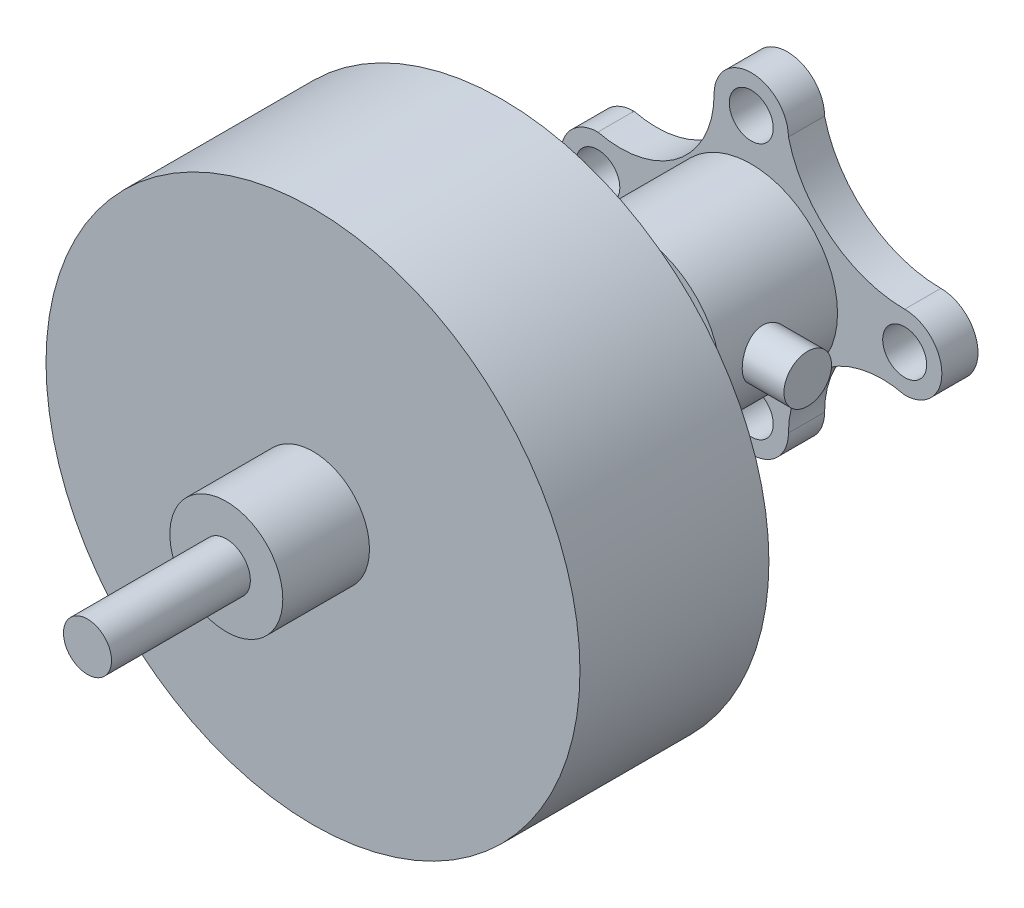
ISO-10303-21;
HEADER;
FILE_DESCRIPTION(('STEP AP214'),'2;1');
FILE_NAME('part.step','',(''),(''),'','','');
FILE_SCHEMA(('AUTOMOTIVE_DESIGN { 1 0 10303 214 1 1 1 1 }'));
ENDSEC;
DATA;
#1=APPLICATION_CONTEXT('core data for automotive mechanical design processes');
#2=APPLICATION_PROTOCOL_DEFINITION('international standard','automotive_design',2000,#1);
#3=PRODUCT_CONTEXT('',#1,'mechanical');
#4=PRODUCT('Part','Part','',(#3));
#5=PRODUCT_RELATED_PRODUCT_CATEGORY('part','',(#4));
#6=PRODUCT_DEFINITION_FORMATION('','',#4);
#7=PRODUCT_DEFINITION_CONTEXT('part definition',#1,'design');
#8=PRODUCT_DEFINITION('design','',#6,#7);
#9=PRODUCT_DEFINITION_SHAPE('','',#8);
#10=(LENGTH_UNIT() NAMED_UNIT(*) SI_UNIT(.MILLI.,.METRE.));
#11=(NAMED_UNIT(*) PLANE_ANGLE_UNIT() SI_UNIT($,.RADIAN.));
#12=(NAMED_UNIT(*) SI_UNIT($,.STERADIAN.) SOLID_ANGLE_UNIT());
#13=UNCERTAINTY_MEASURE_WITH_UNIT(LENGTH_MEASURE(1.E-05),#10,'distance_accuracy_value','');
#14=(GEOMETRIC_REPRESENTATION_CONTEXT(3) GLOBAL_UNCERTAINTY_ASSIGNED_CONTEXT((#13)) GLOBAL_UNIT_ASSIGNED_CONTEXT((#10,
#11,#12)) REPRESENTATION_CONTEXT('',''));
#15=CARTESIAN_POINT('',(0.,0.,0.));
#16=DIRECTION('',(0.,0.,1.));
#17=DIRECTION('',(1.,0.,0.));
#18=AXIS2_PLACEMENT_3D('',#15,#16,#17);
#19=CARTESIAN_POINT('',(0.,0.,34.6964));
#20=DIRECTION('',(0.,0.,1.));
#21=DIRECTION('',(1.,0.,0.));
#22=AXIS2_PLACEMENT_3D('',#19,#20,#21);
#23=PLANE('',#22);
#24=CARTESIAN_POINT('',(0.,0.,34.6964));
#25=DIRECTION('',(0.,0.,1.));
#26=DIRECTION('',(1.,0.,0.));
#27=AXIS2_PLACEMENT_3D('',#24,#25,#26);
#28=CIRCLE('',#27,3.4925);
#29=CARTESIAN_POINT('',(3.4925,0.,34.6964));
#30=VERTEX_POINT('',#29);
#31=EDGE_CURVE('E477',#30,#30,#28,.T.);
#32=ORIENTED_EDGE('',*,*,#31,.T.);
#33=EDGE_LOOP('',(#32));
#34=FACE_BOUND('',#33,.T.);
#35=CARTESIAN_POINT('',(0.,0.,34.6964));
#36=DIRECTION('',(0.,0.,1.));
#37=DIRECTION('',(1.,0.,0.));
#38=AXIS2_PLACEMENT_3D('',#35,#36,#37);
#39=CIRCLE('',#38,1.4859);
#40=CARTESIAN_POINT('',(1.4859,0.,34.6964));
#41=VERTEX_POINT('',#40);
#42=EDGE_CURVE('E474',#41,#41,#39,.T.);
#43=ORIENTED_EDGE('',*,*,#42,.F.);
#44=EDGE_LOOP('',(#43));
#45=FACE_BOUND('',#44,.T.);
#46=ADVANCED_FACE('F35',(#34,#45),#23,.T.);
#47=CARTESIAN_POINT('',(0.,0.,29.337));
#48=DIRECTION('',(0.,0.,1.));
#49=DIRECTION('',(1.,0.,0.));
#50=AXIS2_PLACEMENT_3D('',#47,#48,#49);
#51=PLANE('',#50);
#52=CARTESIAN_POINT('',(0.,0.,29.337));
#53=DIRECTION('',(0.,0.,1.));
#54=DIRECTION('',(1.,0.,0.));
#55=AXIS2_PLACEMENT_3D('',#52,#53,#54);
#56=CIRCLE('',#55,16.51);
#57=CARTESIAN_POINT('',(16.51,0.,29.337));
#58=VERTEX_POINT('',#57);
#59=EDGE_CURVE('E484',#58,#58,#56,.T.);
#60=ORIENTED_EDGE('',*,*,#59,.T.);
#61=EDGE_LOOP('',(#60));
#62=FACE_BOUND('',#61,.T.);
#63=CARTESIAN_POINT('',(0.,0.,29.337));
#64=DIRECTION('',(0.,0.,1.));
#65=DIRECTION('',(1.,0.,0.));
#66=AXIS2_PLACEMENT_3D('',#63,#64,#65);
#67=CIRCLE('',#66,3.4925);
#68=CARTESIAN_POINT('',(3.4925,0.,29.337));
#69=VERTEX_POINT('',#68);
#70=EDGE_CURVE('E473',#69,#69,#67,.T.);
#71=ORIENTED_EDGE('',*,*,#70,.F.);
#72=EDGE_LOOP('',(#71));
#73=FACE_BOUND('',#72,.T.);
#74=ADVANCED_FACE('F198',(#62,#73),#51,.T.);
#75=CARTESIAN_POINT('',(0.,0.,9.4488));
#76=DIRECTION('',(0.,0.,1.));
#77=DIRECTION('',(1.,0.,0.));
#78=AXIS2_PLACEMENT_3D('',#75,#76,#77);
#79=PLANE('',#78);
#80=CARTESIAN_POINT('',(0.,0.,9.4488));
#81=DIRECTION('',(0.,0.,1.));
#82=DIRECTION('',(1.,0.,0.));
#83=AXIS2_PLACEMENT_3D('',#80,#81,#82);
#84=CIRCLE('',#83,5.334);
#85=CARTESIAN_POINT('',(5.334,0.,9.4488));
#86=VERTEX_POINT('',#85);
#87=EDGE_CURVE('E144',#86,#86,#84,.T.);
#88=ORIENTED_EDGE('',*,*,#87,.T.);
#89=EDGE_LOOP('',(#88));
#90=FACE_BOUND('',#89,.T.);
#91=CARTESIAN_POINT('',(0.,0.,9.4488));
#92=DIRECTION('',(0.,0.,1.));
#93=DIRECTION('',(1.,0.,0.));
#94=AXIS2_PLACEMENT_3D('',#91,#92,#93);
#95=CIRCLE('',#94,3.96875);
#96=CARTESIAN_POINT('',(3.96875,0.,9.4488));
#97=VERTEX_POINT('',#96);
#98=EDGE_CURVE('E253',#97,#97,#95,.T.);
#99=ORIENTED_EDGE('',*,*,#98,.F.);
#100=EDGE_LOOP('',(#99));
#101=FACE_BOUND('',#100,.T.);
#102=ADVANCED_FACE('F195',(#90,#101),#79,.T.);
#103=CARTESIAN_POINT('',(0.,0.,2.2352));
#104=DIRECTION('',(0.,0.,1.));
#105=DIRECTION('',(1.,0.,0.));
#106=AXIS2_PLACEMENT_3D('',#103,#104,#105);
#107=PLANE('',#106);
#108=CARTESIAN_POINT('',(0.,-7.9248,2.2352));
#109=DIRECTION('',(0.,0.,1.));
#110=DIRECTION('',(1.,0.,0.));
#111=AXIS2_PLACEMENT_3D('',#108,#109,#110);
#112=CIRCLE('',#111,2.2987);
#113=CARTESIAN_POINT('',(-2.2987,-7.9248,2.2352));
#114=VERTEX_POINT('',#113);
#115=CARTESIAN_POINT('',(2.2987,-7.9248,2.2352));
#116=VERTEX_POINT('',#115);
#117=EDGE_CURVE('E272',#114,#116,#112,.T.);
#118=ORIENTED_EDGE('',*,*,#117,.T.);
#119=CARTESIAN_POINT('',(8.09453348056537,-7.9248,2.2352));
#120=DIRECTION('',(0.,0.,1.));
#121=DIRECTION('',(1.,0.,0.));
#122=AXIS2_PLACEMENT_3D('',#119,#120,#121);
#123=CIRCLE('',#122,5.79583348056537);
#124=CARTESIAN_POINT('',(9.4869,-2.2987,2.2352));
#125=VERTEX_POINT('',#124);
#126=EDGE_CURVE('E101',#116,#125,#123,.F.);
#127=ORIENTED_EDGE('',*,*,#126,.T.);
#128=CARTESIAN_POINT('',(9.4869,0.,2.2352));
#129=DIRECTION('',(0.,0.,1.));
#130=DIRECTION('',(1.,0.,0.));
#131=AXIS2_PLACEMENT_3D('',#128,#129,#130);
#132=CIRCLE('',#131,2.2987);
#133=CARTESIAN_POINT('',(9.4869,2.2987,2.2352));
#134=VERTEX_POINT('',#133);
#135=EDGE_CURVE('E275',#125,#134,#132,.T.);
#136=ORIENTED_EDGE('',*,*,#135,.T.);
#137=CARTESIAN_POINT('',(9.4869,9.70376038374718,2.2352));
#138=DIRECTION('',(0.,0.,1.));
#139=DIRECTION('',(1.,0.,0.));
#140=AXIS2_PLACEMENT_3D('',#137,#138,#139);
#141=CIRCLE('',#140,7.40506038374718);
#142=CARTESIAN_POINT('',(2.2987,7.9248,2.2352));
#143=VERTEX_POINT('',#142);
#144=EDGE_CURVE('E277',#143,#134,#141,.T.);
#145=ORIENTED_EDGE('',*,*,#144,.F.);
#146=CARTESIAN_POINT('',(0.,7.9248,2.2352));
#147=DIRECTION('',(0.,0.,1.));
#148=DIRECTION('',(1.,0.,0.));
#149=AXIS2_PLACEMENT_3D('',#146,#147,#148);
#150=CIRCLE('',#149,2.2987);
#151=CARTESIAN_POINT('',(-2.2987,7.9248,2.2352));
#152=VERTEX_POINT('',#151);
#153=EDGE_CURVE('E122',#143,#152,#150,.T.);
#154=ORIENTED_EDGE('',*,*,#153,.T.);
#155=CARTESIAN_POINT('',(-8.09453348056537,7.9248,2.2352));
#156=DIRECTION('',(0.,0.,1.));
#157=DIRECTION('',(1.,0.,0.));
#158=AXIS2_PLACEMENT_3D('',#155,#156,#157);
#159=CIRCLE('',#158,5.79583348056537);
#160=CARTESIAN_POINT('',(-9.48690000000001,2.2987,2.2352));
#161=VERTEX_POINT('',#160);
#162=EDGE_CURVE('E114',#152,#161,#159,.F.);
#163=ORIENTED_EDGE('',*,*,#162,.T.);
#164=CARTESIAN_POINT('',(-9.4869,0.,2.2352));
#165=DIRECTION('',(0.,0.,1.));
#166=DIRECTION('',(1.,0.,0.));
#167=AXIS2_PLACEMENT_3D('',#164,#165,#166);
#168=CIRCLE('',#167,2.2987);
#169=CARTESIAN_POINT('',(-9.4869,-2.2987,2.2352));
#170=VERTEX_POINT('',#169);
#171=EDGE_CURVE('E119',#161,#170,#168,.T.);
#172=ORIENTED_EDGE('',*,*,#171,.T.);
#173=CARTESIAN_POINT('',(-9.4869,-9.70376038374718,2.2352));
#174=DIRECTION('',(0.,0.,1.));
#175=DIRECTION('',(1.,0.,0.));
#176=AXIS2_PLACEMENT_3D('',#173,#174,#175);
#177=CIRCLE('',#176,7.40506038374718);
#178=EDGE_CURVE('E58',#170,#114,#177,.F.);
#179=ORIENTED_EDGE('',*,*,#178,.T.);
#180=EDGE_LOOP('',(#118,#127,#136,#145,#154,#163,#172,#179));
#181=FACE_BOUND('',#180,.T.);
#182=CARTESIAN_POINT('',(-9.4869,0.,2.2352));
#183=DIRECTION('',(0.,0.,1.));
#184=DIRECTION('',(1.,0.,0.));
#185=AXIS2_PLACEMENT_3D('',#182,#183,#184);
#186=CIRCLE('',#185,1.3589);
#187=CARTESIAN_POINT('',(-8.128,0.,2.2352));
#188=VERTEX_POINT('',#187);
#189=EDGE_CURVE('E269',#188,#188,#186,.T.);
#190=ORIENTED_EDGE('',*,*,#189,.F.);
#191=EDGE_LOOP('',(#190));
#192=FACE_BOUND('',#191,.T.);
#193=CARTESIAN_POINT('',(0.,-7.9248,2.2352));
#194=DIRECTION('',(0.,0.,1.));
#195=DIRECTION('',(1.,0.,0.));
#196=AXIS2_PLACEMENT_3D('',#193,#194,#195);
#197=CIRCLE('',#196,1.3589);
#198=CARTESIAN_POINT('',(1.3589,-7.9248,2.2352));
#199=VERTEX_POINT('',#198);
#200=EDGE_CURVE('E266',#199,#199,#197,.T.);
#201=ORIENTED_EDGE('',*,*,#200,.F.);
#202=EDGE_LOOP('',(#201));
#203=FACE_BOUND('',#202,.T.);
#204=CARTESIAN_POINT('',(0.,7.9248,2.2352));
#205=DIRECTION('',(0.,0.,1.));
#206=DIRECTION('',(1.,0.,0.));
#207=AXIS2_PLACEMENT_3D('',#204,#205,#206);
#208=CIRCLE('',#207,1.3589);
#209=CARTESIAN_POINT('',(1.3589,7.9248,2.2352));
#210=VERTEX_POINT('',#209);
#211=EDGE_CURVE('E263',#210,#210,#208,.T.);
#212=ORIENTED_EDGE('',*,*,#211,.F.);
#213=EDGE_LOOP('',(#212));
#214=FACE_BOUND('',#213,.T.);
#215=CARTESIAN_POINT('',(9.4869,0.,2.2352));
#216=DIRECTION('',(0.,0.,1.));
#217=DIRECTION('',(1.,0.,0.));
#218=AXIS2_PLACEMENT_3D('',#215,#216,#217);
#219=CIRCLE('',#218,1.3589);
#220=CARTESIAN_POINT('',(10.8458,0.,2.2352));
#221=VERTEX_POINT('',#220);
#222=EDGE_CURVE('E169',#221,#221,#219,.T.);
#223=ORIENTED_EDGE('',*,*,#222,.F.);
#224=EDGE_LOOP('',(#223));
#225=FACE_BOUND('',#224,.T.);
#226=CARTESIAN_POINT('',(0.,0.,2.2352));
#227=DIRECTION('',(0.,0.,1.));
#228=DIRECTION('',(1.,0.,0.));
#229=AXIS2_PLACEMENT_3D('',#226,#227,#228);
#230=CIRCLE('',#229,5.334);
#231=CARTESIAN_POINT('',(5.334,0.,2.2352));
#232=VERTEX_POINT('',#231);
#233=EDGE_CURVE('E258',#232,#232,#230,.T.);
#234=ORIENTED_EDGE('',*,*,#233,.F.);
#235=EDGE_LOOP('',(#234));
#236=FACE_BOUND('',#235,.T.);
#237=ADVANCED_FACE('F116',(#181,#192,#203,#214,#225,#236),#107,.T.);
#238=CARTESIAN_POINT('',(0.,-7.9248,2.2352));
#239=DIRECTION('',(0.,0.,-1.));
#240=DIRECTION('',(-1.,0.,0.));
#241=AXIS2_PLACEMENT_3D('',#238,#239,#240);
#242=CYLINDRICAL_SURFACE('',#241,2.2987);
#243=CARTESIAN_POINT('',(0.,-7.9248,0.));
#244=DIRECTION('',(0.,0.,1.));
#245=DIRECTION('',(1.,0.,0.));
#246=AXIS2_PLACEMENT_3D('',#243,#244,#245);
#247=CIRCLE('',#246,2.2987);
#248=CARTESIAN_POINT('',(-2.2987,-7.9248,0.));
#249=VERTEX_POINT('',#248);
#250=CARTESIAN_POINT('',(2.2987,-7.9248,0.));
#251=VERTEX_POINT('',#250);
#252=EDGE_CURVE('E153',#249,#251,#247,.T.);
#253=ORIENTED_EDGE('',*,*,#252,.T.);
#254=DIRECTION('',(0.,0.,-1.));
#255=VECTOR('',#254,1.);
#256=CARTESIAN_POINT('',(2.2987,-7.9248,2.2352));
#257=LINE('',#256,#255);
#258=EDGE_CURVE('E11',#116,#251,#257,.T.);
#259=ORIENTED_EDGE('',*,*,#258,.F.);
#260=ORIENTED_EDGE('',*,*,#117,.F.);
#261=DIRECTION('',(0.,0.,-1.));
#262=VECTOR('',#261,1.);
#263=CARTESIAN_POINT('',(-2.2987,-7.9248,2.2352));
#264=LINE('',#263,#262);
#265=EDGE_CURVE('E136',#114,#249,#264,.T.);
#266=ORIENTED_EDGE('',*,*,#265,.T.);
#267=EDGE_LOOP('',(#253,#259,#260,#266));
#268=FACE_BOUND('',#267,.T.);
#269=ADVANCED_FACE('F204',(#268),#242,.T.);
#270=CARTESIAN_POINT('',(8.09453348056537,-7.9248,2.2352));
#271=DIRECTION('',(0.,0.,-1.));
#272=DIRECTION('',(-1.,0.,0.));
#273=AXIS2_PLACEMENT_3D('',#270,#271,#272);
#274=CYLINDRICAL_SURFACE('',#273,5.79583348056537);
#275=CARTESIAN_POINT('',(8.09453348056537,-7.9248,0.));
#276=DIRECTION('',(0.,0.,1.));
#277=DIRECTION('',(1.,0.,0.));
#278=AXIS2_PLACEMENT_3D('',#275,#276,#277);
#279=CIRCLE('',#278,5.79583348056537);
#280=CARTESIAN_POINT('',(9.4869,-2.2987,0.));
#281=VERTEX_POINT('',#280);
#282=EDGE_CURVE('E156',#251,#281,#279,.F.);
#283=ORIENTED_EDGE('',*,*,#282,.T.);
#284=DIRECTION('',(0.,0.,-1.));
#285=VECTOR('',#284,1.);
#286=CARTESIAN_POINT('',(9.4869,-2.2987,2.2352));
#287=LINE('',#286,#285);
#288=EDGE_CURVE('E49',#125,#281,#287,.T.);
#289=ORIENTED_EDGE('',*,*,#288,.F.);
#290=ORIENTED_EDGE('',*,*,#126,.F.);
#291=ORIENTED_EDGE('',*,*,#258,.T.);
#292=EDGE_LOOP('',(#283,#289,#290,#291));
#293=FACE_BOUND('',#292,.T.);
#294=ADVANCED_FACE('F304',(#293),#274,.F.);
#295=CARTESIAN_POINT('',(9.4869,0.,2.2352));
#296=DIRECTION('',(0.,0.,-1.));
#297=DIRECTION('',(-1.,0.,0.));
#298=AXIS2_PLACEMENT_3D('',#295,#296,#297);
#299=CYLINDRICAL_SURFACE('',#298,2.2987);
#300=CARTESIAN_POINT('',(9.4869,0.,0.));
#301=DIRECTION('',(0.,0.,1.));
#302=DIRECTION('',(1.,0.,0.));
#303=AXIS2_PLACEMENT_3D('',#300,#301,#302);
#304=CIRCLE('',#303,2.2987);
#305=CARTESIAN_POINT('',(9.4869,2.2987,0.));
#306=VERTEX_POINT('',#305);
#307=EDGE_CURVE('E158',#281,#306,#304,.T.);
#308=ORIENTED_EDGE('',*,*,#307,.T.);
#309=DIRECTION('',(0.,0.,-1.));
#310=VECTOR('',#309,1.);
#311=CARTESIAN_POINT('',(9.4869,2.2987,2.2352));
#312=LINE('',#311,#310);
#313=EDGE_CURVE('E175',#134,#306,#312,.T.);
#314=ORIENTED_EDGE('',*,*,#313,.F.);
#315=ORIENTED_EDGE('',*,*,#135,.F.);
#316=ORIENTED_EDGE('',*,*,#288,.T.);
#317=EDGE_LOOP('',(#308,#314,#315,#316));
#318=FACE_BOUND('',#317,.T.);
#319=ADVANCED_FACE('F285',(#318),#299,.T.);
#320=CARTESIAN_POINT('',(9.4869,9.70376038374718,2.2352));
#321=DIRECTION('',(0.,0.,-1.));
#322=DIRECTION('',(-1.,0.,0.));
#323=AXIS2_PLACEMENT_3D('',#320,#321,#322);
#324=CYLINDRICAL_SURFACE('',#323,7.40506038374718);
#325=CARTESIAN_POINT('',(9.4869,9.70376038374718,0.));
#326=DIRECTION('',(0.,0.,1.));
#327=DIRECTION('',(1.,0.,0.));
#328=AXIS2_PLACEMENT_3D('',#325,#326,#327);
#329=CIRCLE('',#328,7.40506038374718);
#330=CARTESIAN_POINT('',(2.2987,7.9248,0.));
#331=VERTEX_POINT('',#330);
#332=EDGE_CURVE('E161',#331,#306,#329,.T.);
#333=ORIENTED_EDGE('',*,*,#332,.F.);
#334=DIRECTION('',(0.,0.,-1.));
#335=VECTOR('',#334,1.);
#336=CARTESIAN_POINT('',(2.2987,7.9248,2.2352));
#337=LINE('',#336,#335);
#338=EDGE_CURVE('E173',#143,#331,#337,.T.);
#339=ORIENTED_EDGE('',*,*,#338,.F.);
#340=ORIENTED_EDGE('',*,*,#144,.T.);
#341=ORIENTED_EDGE('',*,*,#313,.T.);
#342=EDGE_LOOP('',(#333,#339,#340,#341));
#343=FACE_BOUND('',#342,.T.);
#344=ADVANCED_FACE('F281',(#343),#324,.F.);
#345=CARTESIAN_POINT('',(0.,7.9248,2.2352));
#346=DIRECTION('',(0.,0.,-1.));
#347=DIRECTION('',(-1.,0.,0.));
#348=AXIS2_PLACEMENT_3D('',#345,#346,#347);
#349=CYLINDRICAL_SURFACE('',#348,2.2987);
#350=CARTESIAN_POINT('',(0.,7.9248,0.));
#351=DIRECTION('',(0.,0.,1.));
#352=DIRECTION('',(1.,0.,0.));
#353=AXIS2_PLACEMENT_3D('',#350,#351,#352);
#354=CIRCLE('',#353,2.2987);
#355=CARTESIAN_POINT('',(-2.2987,7.9248,0.));
#356=VERTEX_POINT('',#355);
#357=EDGE_CURVE('E164',#331,#356,#354,.T.);
#358=ORIENTED_EDGE('',*,*,#357,.T.);
#359=DIRECTION('',(0.,0.,-1.));
#360=VECTOR('',#359,1.);
#361=CARTESIAN_POINT('',(-2.2987,7.9248,2.2352));
#362=LINE('',#361,#360);
#363=EDGE_CURVE('E131',#152,#356,#362,.T.);
#364=ORIENTED_EDGE('',*,*,#363,.F.);
#365=ORIENTED_EDGE('',*,*,#153,.F.);
#366=ORIENTED_EDGE('',*,*,#338,.T.);
#367=EDGE_LOOP('',(#358,#364,#365,#366));
#368=FACE_BOUND('',#367,.T.);
#369=ADVANCED_FACE('F291',(#368),#349,.T.);
#370=CARTESIAN_POINT('',(-8.09453348056537,7.9248,2.2352));
#371=DIRECTION('',(0.,0.,-1.));
#372=DIRECTION('',(-1.,0.,0.));
#373=AXIS2_PLACEMENT_3D('',#370,#371,#372);
#374=CYLINDRICAL_SURFACE('',#373,5.79583348056537);
#375=CARTESIAN_POINT('',(-8.09453348056537,7.9248,0.));
#376=DIRECTION('',(0.,0.,1.));
#377=DIRECTION('',(1.,0.,0.));
#378=AXIS2_PLACEMENT_3D('',#375,#376,#377);
#379=CIRCLE('',#378,5.79583348056537);
#380=CARTESIAN_POINT('',(-9.48690000000001,2.2987,0.));
#381=VERTEX_POINT('',#380);
#382=EDGE_CURVE('E130',#356,#381,#379,.F.);
#383=ORIENTED_EDGE('',*,*,#382,.T.);
#384=DIRECTION('',(0.,0.,-1.));
#385=VECTOR('',#384,1.);
#386=CARTESIAN_POINT('',(-9.48690000000001,2.2987,2.2352));
#387=LINE('',#386,#385);
#388=EDGE_CURVE('E127',#161,#381,#387,.T.);
#389=ORIENTED_EDGE('',*,*,#388,.F.);
#390=ORIENTED_EDGE('',*,*,#162,.F.);
#391=ORIENTED_EDGE('',*,*,#363,.T.);
#392=EDGE_LOOP('',(#383,#389,#390,#391));
#393=FACE_BOUND('',#392,.T.);
#394=ADVANCED_FACE('F128',(#393),#374,.F.);
#395=CARTESIAN_POINT('',(-9.4869,0.,2.2352));
#396=DIRECTION('',(0.,0.,-1.));
#397=DIRECTION('',(-1.,0.,0.));
#398=AXIS2_PLACEMENT_3D('',#395,#396,#397);
#399=CYLINDRICAL_SURFACE('',#398,2.2987);
#400=CARTESIAN_POINT('',(-9.4869,0.,0.));
#401=DIRECTION('',(0.,0.,1.));
#402=DIRECTION('',(1.,0.,0.));
#403=AXIS2_PLACEMENT_3D('',#400,#401,#402);
#404=CIRCLE('',#403,2.2987);
#405=CARTESIAN_POINT('',(-9.4869,-2.2987,0.));
#406=VERTEX_POINT('',#405);
#407=EDGE_CURVE('E87',#381,#406,#404,.T.);
#408=ORIENTED_EDGE('',*,*,#407,.T.);
#409=DIRECTION('',(0.,0.,-1.));
#410=VECTOR('',#409,1.);
#411=CARTESIAN_POINT('',(-9.4869,-2.2987,2.2352));
#412=LINE('',#411,#410);
#413=EDGE_CURVE('E132',#170,#406,#412,.T.);
#414=ORIENTED_EDGE('',*,*,#413,.F.);
#415=ORIENTED_EDGE('',*,*,#171,.F.);
#416=ORIENTED_EDGE('',*,*,#388,.T.);
#417=EDGE_LOOP('',(#408,#414,#415,#416));
#418=FACE_BOUND('',#417,.T.);
#419=ADVANCED_FACE('F134',(#418),#399,.T.);
#420=CARTESIAN_POINT('',(-9.4869,0.,2.2352));
#421=DIRECTION('',(0.,0.,-1.));
#422=DIRECTION('',(-1.,0.,0.));
#423=AXIS2_PLACEMENT_3D('',#420,#421,#422);
#424=CYLINDRICAL_SURFACE('',#423,1.3589);
#425=ORIENTED_EDGE('',*,*,#189,.T.);
#426=EDGE_LOOP('',(#425));
#427=FACE_BOUND('',#426,.T.);
#428=CARTESIAN_POINT('',(-9.4869,0.,0.));
#429=DIRECTION('',(0.,0.,1.));
#430=DIRECTION('',(1.,0.,0.));
#431=AXIS2_PLACEMENT_3D('',#428,#429,#430);
#432=CIRCLE('',#431,1.3589);
#433=CARTESIAN_POINT('',(-8.128,0.,0.));
#434=VERTEX_POINT('',#433);
#435=EDGE_CURVE('E150',#434,#434,#432,.T.);
#436=ORIENTED_EDGE('',*,*,#435,.F.);
#437=EDGE_LOOP('',(#436));
#438=FACE_BOUND('',#437,.T.);
#439=ADVANCED_FACE('F310',(#427,#438),#424,.F.);
#440=CARTESIAN_POINT('',(0.,-7.9248,2.2352));
#441=DIRECTION('',(0.,0.,-1.));
#442=DIRECTION('',(-1.,0.,0.));
#443=AXIS2_PLACEMENT_3D('',#440,#441,#442);
#444=CYLINDRICAL_SURFACE('',#443,1.3589);
#445=ORIENTED_EDGE('',*,*,#200,.T.);
#446=EDGE_LOOP('',(#445));
#447=FACE_BOUND('',#446,.T.);
#448=CARTESIAN_POINT('',(0.,-7.9248,0.));
#449=DIRECTION('',(0.,0.,1.));
#450=DIRECTION('',(1.,0.,0.));
#451=AXIS2_PLACEMENT_3D('',#448,#449,#450);
#452=CIRCLE('',#451,1.3589);
#453=CARTESIAN_POINT('',(1.3589,-7.9248,0.));
#454=VERTEX_POINT('',#453);
#455=EDGE_CURVE('E147',#454,#454,#452,.T.);
#456=ORIENTED_EDGE('',*,*,#455,.F.);
#457=EDGE_LOOP('',(#456));
#458=FACE_BOUND('',#457,.T.);
#459=ADVANCED_FACE('F313',(#447,#458),#444,.F.);
#460=CARTESIAN_POINT('',(0.,7.9248,2.2352));
#461=DIRECTION('',(0.,0.,-1.));
#462=DIRECTION('',(-1.,0.,0.));
#463=AXIS2_PLACEMENT_3D('',#460,#461,#462);
#464=CYLINDRICAL_SURFACE('',#463,1.3589);
#465=ORIENTED_EDGE('',*,*,#211,.T.);
#466=EDGE_LOOP('',(#465));
#467=FACE_BOUND('',#466,.T.);
#468=CARTESIAN_POINT('',(0.,7.9248,0.));
#469=DIRECTION('',(0.,0.,1.));
#470=DIRECTION('',(1.,0.,0.));
#471=AXIS2_PLACEMENT_3D('',#468,#469,#470);
#472=CIRCLE('',#471,1.3589);
#473=CARTESIAN_POINT('',(1.3589,7.9248,0.));
#474=VERTEX_POINT('',#473);
#475=EDGE_CURVE('E143',#474,#474,#472,.T.);
#476=ORIENTED_EDGE('',*,*,#475,.F.);
#477=EDGE_LOOP('',(#476));
#478=FACE_BOUND('',#477,.T.);
#479=ADVANCED_FACE('F316',(#467,#478),#464,.F.);
#480=CARTESIAN_POINT('',(9.4869,0.,2.2352));
#481=DIRECTION('',(0.,0.,-1.));
#482=DIRECTION('',(-1.,0.,0.));
#483=AXIS2_PLACEMENT_3D('',#480,#481,#482);
#484=CYLINDRICAL_SURFACE('',#483,1.3589);
#485=ORIENTED_EDGE('',*,*,#222,.T.);
#486=EDGE_LOOP('',(#485));
#487=FACE_BOUND('',#486,.T.);
#488=CARTESIAN_POINT('',(9.4869,0.,0.));
#489=DIRECTION('',(0.,0.,1.));
#490=DIRECTION('',(1.,0.,0.));
#491=AXIS2_PLACEMENT_3D('',#488,#489,#490);
#492=CIRCLE('',#491,1.3589);
#493=CARTESIAN_POINT('',(10.8458,0.,0.));
#494=VERTEX_POINT('',#493);
#495=EDGE_CURVE('E140',#494,#494,#492,.T.);
#496=ORIENTED_EDGE('',*,*,#495,.F.);
#497=EDGE_LOOP('',(#496));
#498=FACE_BOUND('',#497,.T.);
#499=ADVANCED_FACE('F37',(#487,#498),#484,.F.);
#500=CARTESIAN_POINT('',(-9.4869,-9.70376038374718,2.2352));
#501=DIRECTION('',(0.,0.,-1.));
#502=DIRECTION('',(-1.,0.,0.));
#503=AXIS2_PLACEMENT_3D('',#500,#501,#502);
#504=CYLINDRICAL_SURFACE('',#503,7.40506038374718);
#505=CARTESIAN_POINT('',(-9.4869,-9.70376038374718,0.));
#506=DIRECTION('',(0.,0.,1.));
#507=DIRECTION('',(1.,0.,0.));
#508=AXIS2_PLACEMENT_3D('',#505,#506,#507);
#509=CIRCLE('',#508,7.40506038374718);
#510=EDGE_CURVE('E93',#406,#249,#509,.F.);
#511=ORIENTED_EDGE('',*,*,#510,.T.);
#512=ORIENTED_EDGE('',*,*,#265,.F.);
#513=ORIENTED_EDGE('',*,*,#178,.F.);
#514=ORIENTED_EDGE('',*,*,#413,.T.);
#515=EDGE_LOOP('',(#511,#512,#513,#514));
#516=FACE_BOUND('',#515,.T.);
#517=ADVANCED_FACE('F323',(#516),#504,.F.);
#518=CARTESIAN_POINT('',(0.,0.,0.));
#519=DIRECTION('',(0.,0.,1.));
#520=DIRECTION('',(1.,0.,0.));
#521=AXIS2_PLACEMENT_3D('',#518,#519,#520);
#522=PLANE('',#521);
#523=ORIENTED_EDGE('',*,*,#495,.T.);
#524=EDGE_LOOP('',(#523));
#525=FACE_BOUND('',#524,.T.);
#526=ORIENTED_EDGE('',*,*,#475,.T.);
#527=EDGE_LOOP('',(#526));
#528=FACE_BOUND('',#527,.T.);
#529=ORIENTED_EDGE('',*,*,#455,.T.);
#530=EDGE_LOOP('',(#529));
#531=FACE_BOUND('',#530,.T.);
#532=ORIENTED_EDGE('',*,*,#435,.T.);
#533=EDGE_LOOP('',(#532));
#534=FACE_BOUND('',#533,.T.);
#535=ORIENTED_EDGE('',*,*,#252,.F.);
#536=ORIENTED_EDGE('',*,*,#510,.F.);
#537=ORIENTED_EDGE('',*,*,#407,.F.);
#538=ORIENTED_EDGE('',*,*,#382,.F.);
#539=ORIENTED_EDGE('',*,*,#357,.F.);
#540=ORIENTED_EDGE('',*,*,#332,.T.);
#541=ORIENTED_EDGE('',*,*,#307,.F.);
#542=ORIENTED_EDGE('',*,*,#282,.F.);
#543=EDGE_LOOP('',(#535,#536,#537,#538,#539,#540,#541,#542));
#544=FACE_BOUND('',#543,.T.);
#545=ADVANCED_FACE('F243',(#525,#528,#531,#534,#544),#522,.F.);
#546=CARTESIAN_POINT('',(0.,0.,9.4488));
#547=DIRECTION('',(0.,0.,-1.));
#548=DIRECTION('',(-1.,0.,0.));
#549=AXIS2_PLACEMENT_3D('',#546,#547,#548);
#550=CYLINDRICAL_SURFACE('',#549,5.334);
#551=CARTESIAN_POINT('',(-5.334,0.,8.128));
#552=CARTESIAN_POINT('',(-5.3339988938536,-0.0811048442048899,8.12799830862194));
#553=CARTESIAN_POINT('',(-5.33213210525664,-0.162227420380499,8.12127994338323));
#554=CARTESIAN_POINT('',(-5.32486668681683,-0.322128600502706,8.09463597364742));
#555=CARTESIAN_POINT('',(-5.31946653666953,-0.400906180202991,8.07470468395811));
#556=CARTESIAN_POINT('',(-5.30572925126204,-0.553786685326264,8.0223376029085));
#557=CARTESIAN_POINT('',(-5.29739605661758,-0.62789572631437,7.98991858362321));
#558=CARTESIAN_POINT('',(-5.27866931844204,-0.769625359058751,7.91356032188308));
#559=CARTESIAN_POINT('',(-5.26827559853027,-0.837245394621168,7.86962009311035));
#560=CARTESIAN_POINT('',(-5.24625897176006,-0.965749071175915,7.77032045992586));
#561=CARTESIAN_POINT('',(-5.23461387156472,-1.02644948508123,7.71472886200439));
#562=CARTESIAN_POINT('',(-5.21154660820079,-1.13779524088235,7.59420045716671));
#563=CARTESIAN_POINT('',(-5.2001244761966,-1.18843918612571,7.5292623543556));
#564=CARTESIAN_POINT('',(-5.17856732036616,-1.27914700107581,7.39039777564094));
#565=CARTESIAN_POINT('',(-5.16846018651882,-1.31899657395051,7.31632658902508));
#566=CARTESIAN_POINT('',(-5.15100521087635,-1.38560282708588,7.16221098045951));
#567=CARTESIAN_POINT('',(-5.14365681897352,-1.41236211794068,7.08216775318627));
#568=CARTESIAN_POINT('',(-5.13278106710548,-1.45138515082193,6.92041758334296));
#569=CARTESIAN_POINT('',(-5.12916589134413,-1.46398268187797,6.83879722135408));
#570=CARTESIAN_POINT('',(-5.12590382433651,-1.47536573661719,6.67452768098418));
#571=CARTESIAN_POINT('',(-5.12625613279134,-1.47415404581937,6.59187871344749));
#572=CARTESIAN_POINT('',(-5.13081083947713,-1.45821726577817,6.43053248618287));
#573=CARTESIAN_POINT('',(-5.13489707330814,-1.44389987848755,6.35179114961258));
#574=CARTESIAN_POINT('',(-5.14627268635562,-1.40281267923302,6.19787426504783));
#575=CARTESIAN_POINT('',(-5.15356233811008,-1.3760418077496,6.12269902104977));
#576=CARTESIAN_POINT('',(-5.17062293928162,-1.310484270946,5.97700366011576));
#577=CARTESIAN_POINT('',(-5.18042253785638,-1.27155764934793,5.90655001522101));
#578=CARTESIAN_POINT('',(-5.20138391710733,-1.18289111382407,5.77303334985143));
#579=CARTESIAN_POINT('',(-5.21254598314122,-1.13314893295715,5.70997188304842));
#580=CARTESIAN_POINT('',(-5.23545476861648,-1.02219503497709,5.59070474052663));
#581=CARTESIAN_POINT('',(-5.24720825743292,-0.960642012685163,5.53481740578648));
#582=CARTESIAN_POINT('',(-5.26962537897173,-0.828892637555138,5.43409066753947));
#583=CARTESIAN_POINT('',(-5.28028896231895,-0.758695893454362,5.38925176442167));
#584=CARTESIAN_POINT('',(-5.2993984815204,-0.611135355992813,5.31174028210279));
#585=CARTESIAN_POINT('',(-5.30783320821474,-0.533737887875452,5.27912886485519));
#586=CARTESIAN_POINT('',(-5.32145378482016,-0.374272038097201,5.22747435737749));
#587=CARTESIAN_POINT('',(-5.32664039805512,-0.292204758815765,5.20842807912324));
#588=CARTESIAN_POINT('',(-5.3330634531528,-0.128442737737243,5.18495257292629));
#589=CARTESIAN_POINT('',(-5.33441671508389,-0.0468144708859026,5.18009093011266));
#590=CARTESIAN_POINT('',(-5.33335833788866,0.116092314606583,5.18392363729435));
#591=CARTESIAN_POINT('',(-5.33094711849068,0.197370871226193,5.19261647600562));
#592=CARTESIAN_POINT('',(-5.32270647616318,0.355703321880116,5.22295793657711));
#593=CARTESIAN_POINT('',(-5.31694156053788,0.432807707817432,5.24436221564173));
#594=CARTESIAN_POINT('',(-5.30265055390433,0.582321508068221,5.29923242725527));
#595=CARTESIAN_POINT('',(-5.29412415318753,0.65473039467406,5.33269971275288));
#596=CARTESIAN_POINT('',(-5.27498611342791,0.794453666039949,5.41152678161293));
#597=CARTESIAN_POINT('',(-5.26433508980922,0.861632157918571,5.45711763282173));
#598=CARTESIAN_POINT('',(-5.24217725476684,0.987535859602673,5.55860996355448));
#599=CARTESIAN_POINT('',(-5.23067026193859,1.0462592697473,5.61451363239815));
#600=CARTESIAN_POINT('',(-5.20766227302567,1.15543122224973,5.73706750190872));
#601=CARTESIAN_POINT('',(-5.19617210126908,1.20557380914381,5.80399281362295));
#602=CARTESIAN_POINT('',(-5.17487983218462,1.29392730022256,5.94555360896877));
#603=CARTESIAN_POINT('',(-5.16507766930616,1.33213866778021,6.02018879302204));
#604=CARTESIAN_POINT('',(-5.14838536336067,1.39526013477156,6.17470542533889));
#605=CARTESIAN_POINT('',(-5.14147898385306,1.42024460963057,6.25455463990755));
#606=CARTESIAN_POINT('',(-5.13136657099027,1.45636246085779,6.41754655662913));
#607=CARTESIAN_POINT('',(-5.12815950697807,1.46749969523835,6.50068833476888));
#608=CARTESIAN_POINT('',(-5.12589930511912,1.47537339642269,6.66476083881802));
#609=CARTESIAN_POINT('',(-5.12670379595191,1.47260341031141,6.74566626012004));
#610=CARTESIAN_POINT('',(-5.13204024671807,1.45389529892908,6.90580837311441));
#611=CARTESIAN_POINT('',(-5.1365720971332,1.43795756055623,6.9850451137662));
#612=CARTESIAN_POINT('',(-5.14876481763076,1.39366188888477,7.13892870829586));
#613=CARTESIAN_POINT('',(-5.15639749369339,1.36541570541233,7.21361012272373));
#614=CARTESIAN_POINT('',(-5.17393078172038,1.2973914084829,7.35723181880109));
#615=CARTESIAN_POINT('',(-5.18383177243785,1.25761136885898,7.42617113903696));
#616=CARTESIAN_POINT('',(-5.20517423285102,1.16618316500602,7.55868979432678));
#617=CARTESIAN_POINT('',(-5.21665430218988,1.11420165922066,7.62203295372444));
#618=CARTESIAN_POINT('',(-5.23965407826013,1.00047066764836,7.73925754699807));
#619=CARTESIAN_POINT('',(-5.25117379408742,0.938718770663556,7.79313663832813));
#620=CARTESIAN_POINT('',(-5.27327825034953,0.80545304574635,7.89115097544564));
#621=CARTESIAN_POINT('',(-5.28383472721489,0.733744240948631,7.93502806923253));
#622=CARTESIAN_POINT('',(-5.30250666297983,0.583677481353932,8.01003640118362));
#623=CARTESIAN_POINT('',(-5.31062357440057,0.505323518872424,8.04117522773682));
#624=CARTESIAN_POINT('',(-5.32254410737967,0.356133691551906,8.08610415910768));
#625=CARTESIAN_POINT('',(-5.32680764563284,0.285896037640361,8.10177701257397));
#626=CARTESIAN_POINT('',(-5.33253592120001,0.143776773626788,8.12272508450572));
#627=CARTESIAN_POINT('',(-5.33400098054299,0.0718953536410889,8.12800149932134));
#628=CARTESIAN_POINT('',(-5.334,0.,8.128));
#629=B_SPLINE_CURVE_WITH_KNOTS('',3,(#551,#552,#553,#554,#555,#556,#557,#558,#559,#560,#561,
#562,#563,#564,#565,#566,#567,#568,#569,#570,#571,#572,#573,#574,#575,#576,#577,#578,#579,#580,
#581,#582,#583,#584,#585,#586,#587,#588,#589,#590,#591,#592,#593,#594,#595,#596,#597,#598,#599,
#600,#601,#602,#603,#604,#605,#606,#607,#608,#609,#610,#611,#612,#613,#614,#615,#616,#617,#618,
#619,#620,#621,#622,#623,#624,#625,#626,#627,#628),.UNSPECIFIED.,.T.,.F.,(4,2,2,2,2,2,2,2,2,2,2,
2,2,2,2,2,2,2,2,2,2,2,2,2,2,2,2,2,2,2,2,2,2,2,2,2,2,2,4),(0.,0.243050757785696,
0.486206162193675,0.729036120694084,0.971886874387729,1.22013772193229,1.46842302272695,
1.72132616413658,1.97417884850567,2.22093800592857,2.46764738935518,2.70693352860199,
2.94624002959739,3.18841025058942,3.43063127947263,3.68135448874848,3.9320890513189,
4.18406156818133,4.43597484792338,4.68012399333479,4.92424591879496,5.16382059781591,
5.40342215514135,5.64796599028278,5.89256179977946,6.14459599904738,6.39662040884064,
6.64721220328483,6.89773416410076,7.13942966487294,7.38111806433993,7.62065643275422,
7.86023482740925,8.10733352842908,8.35449330539189,8.60744959497548,8.8602549742488,
9.07573200914396,9.29118424698555),.UNSPECIFIED.);
#630=CARTESIAN_POINT('',(-5.334,0.,8.128));
#631=VERTEX_POINT('',#630);
#632=EDGE_CURVE('E39',#631,#631,#629,.T.);
#633=ORIENTED_EDGE('',*,*,#632,.T.);
#634=EDGE_LOOP('',(#633));
#635=FACE_BOUND('',#634,.T.);
#636=CARTESIAN_POINT('',(5.334,0.,5.1816));
#637=CARTESIAN_POINT('',(5.3339988938536,-0.0811048442048899,5.18160169137806));
#638=CARTESIAN_POINT('',(5.33213210525664,-0.162227420380499,5.18832005661677));
#639=CARTESIAN_POINT('',(5.32486668681683,-0.322128600502706,5.21496402635258));
#640=CARTESIAN_POINT('',(5.31946653666953,-0.400906180202991,5.23489531604188));
#641=CARTESIAN_POINT('',(5.30572925126204,-0.553786685326264,5.28726239709149));
#642=CARTESIAN_POINT('',(5.29739605661758,-0.62789572631437,5.31968141637679));
#643=CARTESIAN_POINT('',(5.27866931844204,-0.769625359058751,5.39603967811692));
#644=CARTESIAN_POINT('',(5.26827559853027,-0.837245394621167,5.43997990688965));
#645=CARTESIAN_POINT('',(5.24625897176006,-0.965749071175915,5.53927954007414));
#646=CARTESIAN_POINT('',(5.23461387156472,-1.02644948508123,5.59487113799561));
#647=CARTESIAN_POINT('',(5.21154660820079,-1.13779524088235,5.71539954283329));
#648=CARTESIAN_POINT('',(5.2001244761966,-1.18843918612571,5.7803376456444));
#649=CARTESIAN_POINT('',(5.17856732036616,-1.27914700107581,5.91920222435906));
#650=CARTESIAN_POINT('',(5.16846018651882,-1.31899657395051,5.99327341097492));
#651=CARTESIAN_POINT('',(5.15100521087635,-1.38560282708588,6.14738901954049));
#652=CARTESIAN_POINT('',(5.14365681897352,-1.41236211794068,6.22743224681373));
#653=CARTESIAN_POINT('',(5.13278106710548,-1.45138515082193,6.38918241665704));
#654=CARTESIAN_POINT('',(5.12916589134413,-1.46398268187797,6.47080277864592));
#655=CARTESIAN_POINT('',(5.12590382433651,-1.47536573661719,6.63507231901582));
#656=CARTESIAN_POINT('',(5.12625613279134,-1.47415404581937,6.71772128655251));
#657=CARTESIAN_POINT('',(5.13081083947713,-1.45821726577817,6.87906751381713));
#658=CARTESIAN_POINT('',(5.13489707330814,-1.44389987848755,6.95780885038742));
#659=CARTESIAN_POINT('',(5.14627268635562,-1.40281267923302,7.11172573495217));
#660=CARTESIAN_POINT('',(5.15356233811008,-1.3760418077496,7.18690097895023));
#661=CARTESIAN_POINT('',(5.17062293928162,-1.310484270946,7.33259633988424));
#662=CARTESIAN_POINT('',(5.18042253785638,-1.27155764934793,7.40304998477899));
#663=CARTESIAN_POINT('',(5.20138391710733,-1.18289111382407,7.53656665014857));
#664=CARTESIAN_POINT('',(5.21254598314122,-1.13314893295715,7.59962811695158));
#665=CARTESIAN_POINT('',(5.23545476861648,-1.02219503497709,7.71889525947337));
#666=CARTESIAN_POINT('',(5.24720825743292,-0.960642012685163,7.77478259421352));
#667=CARTESIAN_POINT('',(5.26962537897174,-0.828892637555138,7.87550933246053));
#668=CARTESIAN_POINT('',(5.28028896231895,-0.758695893454362,7.92034823557833));
#669=CARTESIAN_POINT('',(5.2993984815204,-0.611135355992813,7.9978597178972));
#670=CARTESIAN_POINT('',(5.30783320821474,-0.533737887875452,8.03047113514481));
#671=CARTESIAN_POINT('',(5.32145378482016,-0.3742720380972,8.08212564262251));
#672=CARTESIAN_POINT('',(5.32664039805512,-0.292204758815764,8.10117192087675));
#673=CARTESIAN_POINT('',(5.3330634531528,-0.128442737737242,8.12464742707371));
#674=CARTESIAN_POINT('',(5.33441671508389,-0.046814470885901,8.12950906988734));
#675=CARTESIAN_POINT('',(5.33335833788866,0.116092314606584,8.12567636270565));
#676=CARTESIAN_POINT('',(5.33094711849068,0.197370871226194,8.11698352399438));
#677=CARTESIAN_POINT('',(5.32270647616318,0.355703321880118,8.08664206342289));
#678=CARTESIAN_POINT('',(5.31694156053788,0.432807707817433,8.06523778435827));
#679=CARTESIAN_POINT('',(5.30265055390433,0.582321508068222,8.01036757274473));
#680=CARTESIAN_POINT('',(5.29412415318753,0.654730394674061,7.97690028724712));
#681=CARTESIAN_POINT('',(5.27498611342791,0.79445366603995,7.89807321838707));
#682=CARTESIAN_POINT('',(5.26433508980922,0.861632157918572,7.85248236717826));
#683=CARTESIAN_POINT('',(5.24217725476684,0.987535859602674,7.75099003644552));
#684=CARTESIAN_POINT('',(5.23067026193859,1.0462592697473,7.69508636760185));
#685=CARTESIAN_POINT('',(5.20766227302567,1.15543122224973,7.57253249809128));
#686=CARTESIAN_POINT('',(5.19617210126908,1.20557380914381,7.50560718637705));
#687=CARTESIAN_POINT('',(5.17487983218462,1.29392730022256,7.36404639103123));
#688=CARTESIAN_POINT('',(5.16507766930616,1.33213866778021,7.28941120697796));
#689=CARTESIAN_POINT('',(5.14838536336067,1.39526013477156,7.1348945746611));
#690=CARTESIAN_POINT('',(5.14147898385306,1.42024460963057,7.05504536009245));
#691=CARTESIAN_POINT('',(5.13136657099027,1.45636246085779,6.89205344337087));
#692=CARTESIAN_POINT('',(5.12815950697807,1.46749969523835,6.80891166523112));
#693=CARTESIAN_POINT('',(5.12589930511912,1.47537339642269,6.64483916118198));
#694=CARTESIAN_POINT('',(5.12670379595191,1.47260341031141,6.56393373987996));
#695=CARTESIAN_POINT('',(5.13204024671807,1.45389529892908,6.40379162688559));
#696=CARTESIAN_POINT('',(5.1365720971332,1.43795756055623,6.3245548862338));
#697=CARTESIAN_POINT('',(5.14876481763076,1.39366188888477,6.17067129170414));
#698=CARTESIAN_POINT('',(5.15639749369339,1.36541570541233,6.09598987727627));
#699=CARTESIAN_POINT('',(5.17393078172038,1.2973914084829,5.95236818119891));
#700=CARTESIAN_POINT('',(5.18383177243785,1.25761136885898,5.88342886096304));
#701=CARTESIAN_POINT('',(5.20517423285102,1.16618316500602,5.75091020567322));
#702=CARTESIAN_POINT('',(5.21665430218988,1.11420165922066,5.68756704627556));
#703=CARTESIAN_POINT('',(5.23965407826013,1.00047066764836,5.57034245300193));
#704=CARTESIAN_POINT('',(5.25117379408742,0.938718770663555,5.51646336167187));
#705=CARTESIAN_POINT('',(5.27327825034953,0.805453045746349,5.41844902455436));
#706=CARTESIAN_POINT('',(5.28383472721489,0.73374424094863,5.37457193076747));
#707=CARTESIAN_POINT('',(5.30250666297983,0.58367748135393,5.29956359881638));
#708=CARTESIAN_POINT('',(5.31062357440057,0.505323518872423,5.26842477226318));
#709=CARTESIAN_POINT('',(5.32254410737967,0.356133691551905,5.22349584089232));
#710=CARTESIAN_POINT('',(5.32680764563284,0.285896037640359,5.20782298742603));
#711=CARTESIAN_POINT('',(5.33253592120001,0.143776773626787,5.18687491549428));
#712=CARTESIAN_POINT('',(5.33400098054299,0.0718953536410883,5.18159850067866));
#713=CARTESIAN_POINT('',(5.334,0.,5.1816));
#714=B_SPLINE_CURVE_WITH_KNOTS('',3,(#636,#637,#638,#639,#640,#641,#642,#643,#644,#645,#646,
#647,#648,#649,#650,#651,#652,#653,#654,#655,#656,#657,#658,#659,#660,#661,#662,#663,#664,#665,
#666,#667,#668,#669,#670,#671,#672,#673,#674,#675,#676,#677,#678,#679,#680,#681,#682,#683,#684,
#685,#686,#687,#688,#689,#690,#691,#692,#693,#694,#695,#696,#697,#698,#699,#700,#701,#702,#703,
#704,#705,#706,#707,#708,#709,#710,#711,#712,#713),.UNSPECIFIED.,.T.,.F.,(4,2,2,2,2,2,2,2,2,2,2,
2,2,2,2,2,2,2,2,2,2,2,2,2,2,2,2,2,2,2,2,2,2,2,2,2,2,2,4),(0.,0.243050757785696,
0.486206162193675,0.729036120694084,0.971886874387728,1.22013772193229,1.46842302272695,
1.72132616413658,1.97417884850567,2.22093800592858,2.46764738935518,2.70693352860199,
2.9462400295974,3.18841025058943,3.43063127947263,3.68135448874848,3.9320890513189,
4.18406156818133,4.43597484792338,4.68012399333479,4.92424591879496,5.16382059781592,
5.40342215514135,5.64796599028278,5.89256179977946,6.14459599904738,6.39662040884064,
6.64721220328483,6.89773416410076,7.13942966487295,7.38111806433994,7.62065643275423,
7.86023482740926,8.10733352842908,8.3544933053919,8.60744959497548,8.8602549742488,
9.07573200914396,9.29118424698556),.UNSPECIFIED.);
#715=CARTESIAN_POINT('',(5.334,0.,5.1816));
#716=VERTEX_POINT('',#715);
#717=EDGE_CURVE('E178',#716,#716,#714,.T.);
#718=ORIENTED_EDGE('',*,*,#717,.T.);
#719=EDGE_LOOP('',(#718));
#720=FACE_BOUND('',#719,.T.);
#721=ORIENTED_EDGE('',*,*,#87,.F.);
#722=EDGE_LOOP('',(#721));
#723=FACE_BOUND('',#722,.T.);
#724=ORIENTED_EDGE('',*,*,#233,.T.);
#725=EDGE_LOOP('',(#724));
#726=FACE_BOUND('',#725,.T.);
#727=ADVANCED_FACE('F183',(#635,#720,#723,#726),#550,.T.);
#728=CARTESIAN_POINT('',(7.9121,0.,6.6548));
#729=DIRECTION('',(1.,0.,0.));
#730=DIRECTION('',(0.,0.,-1.));
#731=AXIS2_PLACEMENT_3D('',#728,#729,#730);
#732=PLANE('',#731);
#733=CARTESIAN_POINT('',(7.9121,0.,6.6548));
#734=DIRECTION('',(1.,0.,0.));
#735=DIRECTION('',(0.,0.,-1.));
#736=AXIS2_PLACEMENT_3D('',#733,#734,#735);
#737=CIRCLE('',#736,1.4732);
#738=CARTESIAN_POINT('',(7.9121,0.,5.1816));
#739=VERTEX_POINT('',#738);
#740=EDGE_CURVE('E247',#739,#739,#737,.T.);
#741=ORIENTED_EDGE('',*,*,#740,.T.);
#742=EDGE_LOOP('',(#741));
#743=FACE_BOUND('',#742,.T.);
#744=ADVANCED_FACE('F235',(#743),#732,.T.);
#745=CARTESIAN_POINT('',(-7.9121,0.,6.6548));
#746=DIRECTION('',(1.,0.,0.));
#747=DIRECTION('',(0.,0.,-1.));
#748=AXIS2_PLACEMENT_3D('',#745,#746,#747);
#749=CYLINDRICAL_SURFACE('',#748,1.4732);
#750=ORIENTED_EDGE('',*,*,#740,.F.);
#751=EDGE_LOOP('',(#750));
#752=FACE_BOUND('',#751,.T.);
#753=ORIENTED_EDGE('',*,*,#717,.F.);
#754=EDGE_LOOP('',(#753));
#755=FACE_BOUND('',#754,.T.);
#756=ADVANCED_FACE('F192',(#752,#755),#749,.T.);
#757=CARTESIAN_POINT('',(-7.9121,0.,6.6548));
#758=DIRECTION('',(1.,0.,0.));
#759=DIRECTION('',(0.,0.,-1.));
#760=AXIS2_PLACEMENT_3D('',#757,#758,#759);
#761=CIRCLE('',#760,1.4732);
#762=CARTESIAN_POINT('',(-7.9121,0.,5.1816));
#763=VERTEX_POINT('',#762);
#764=EDGE_CURVE('E182',#763,#763,#761,.T.);
#765=ORIENTED_EDGE('',*,*,#764,.T.);
#766=EDGE_LOOP('',(#765));
#767=FACE_BOUND('',#766,.T.);
#768=ORIENTED_EDGE('',*,*,#632,.F.);
#769=EDGE_LOOP('',(#768));
#770=FACE_BOUND('',#769,.T.);
#771=ADVANCED_FACE('F187',(#767,#770),#749,.T.);
#772=CARTESIAN_POINT('',(-7.9121,0.,6.6548));
#773=DIRECTION('',(1.,0.,0.));
#774=DIRECTION('',(0.,0.,-1.));
#775=AXIS2_PLACEMENT_3D('',#772,#773,#774);
#776=PLANE('',#775);
#777=ORIENTED_EDGE('',*,*,#764,.F.);
#778=EDGE_LOOP('',(#777));
#779=FACE_BOUND('',#778,.T.);
#780=ADVANCED_FACE('F191',(#779),#776,.F.);
#781=CARTESIAN_POINT('',(0.,0.,17.653));
#782=DIRECTION('',(0.,0.,-1.));
#783=DIRECTION('',(-1.,0.,0.));
#784=AXIS2_PLACEMENT_3D('',#781,#782,#783);
#785=CYLINDRICAL_SURFACE('',#784,3.96875);
#786=CARTESIAN_POINT('',(0.,0.,17.653));
#787=DIRECTION('',(0.,0.,1.));
#788=DIRECTION('',(1.,0.,0.));
#789=AXIS2_PLACEMENT_3D('',#786,#787,#788);
#790=CIRCLE('',#789,3.96875);
#791=CARTESIAN_POINT('',(3.96875,0.,17.653));
#792=VERTEX_POINT('',#791);
#793=EDGE_CURVE('E248',#792,#792,#790,.T.);
#794=ORIENTED_EDGE('',*,*,#793,.F.);
#795=EDGE_LOOP('',(#794));
#796=FACE_BOUND('',#795,.T.);
#797=ORIENTED_EDGE('',*,*,#98,.T.);
#798=EDGE_LOOP('',(#797));
#799=FACE_BOUND('',#798,.T.);
#800=ADVANCED_FACE('F228',(#796,#799),#785,.T.);
#801=CARTESIAN_POINT('',(0.,0.,17.653));
#802=DIRECTION('',(0.,0.,1.));
#803=DIRECTION('',(1.,0.,0.));
#804=AXIS2_PLACEMENT_3D('',#801,#802,#803);
#805=PLANE('',#804);
#806=CARTESIAN_POINT('',(0.,0.,17.653));
#807=DIRECTION('',(0.,0.,1.));
#808=DIRECTION('',(1.,0.,0.));
#809=AXIS2_PLACEMENT_3D('',#806,#807,#808);
#810=CIRCLE('',#809,16.51);
#811=CARTESIAN_POINT('',(16.51,0.,17.653));
#812=VERTEX_POINT('',#811);
#813=EDGE_CURVE('E482',#812,#812,#810,.T.);
#814=ORIENTED_EDGE('',*,*,#813,.F.);
#815=EDGE_LOOP('',(#814));
#816=FACE_BOUND('',#815,.T.);
#817=ORIENTED_EDGE('',*,*,#793,.T.);
#818=EDGE_LOOP('',(#817));
#819=FACE_BOUND('',#818,.T.);
#820=ADVANCED_FACE('F225',(#816,#819),#805,.F.);
#821=CARTESIAN_POINT('',(0.,0.,29.337));
#822=DIRECTION('',(0.,0.,-1.));
#823=DIRECTION('',(-1.,0.,0.));
#824=AXIS2_PLACEMENT_3D('',#821,#822,#823);
#825=CYLINDRICAL_SURFACE('',#824,16.51);
#826=ORIENTED_EDGE('',*,*,#59,.F.);
#827=EDGE_LOOP('',(#826));
#828=FACE_BOUND('',#827,.T.);
#829=ORIENTED_EDGE('',*,*,#813,.T.);
#830=EDGE_LOOP('',(#829));
#831=FACE_BOUND('',#830,.T.);
#832=ADVANCED_FACE('F222',(#828,#831),#825,.T.);
#833=CARTESIAN_POINT('',(0.,0.,34.6964));
#834=DIRECTION('',(0.,0.,-1.));
#835=DIRECTION('',(-1.,0.,0.));
#836=AXIS2_PLACEMENT_3D('',#833,#834,#835);
#837=CYLINDRICAL_SURFACE('',#836,3.4925);
#838=ORIENTED_EDGE('',*,*,#31,.F.);
#839=EDGE_LOOP('',(#838));
#840=FACE_BOUND('',#839,.T.);
#841=ORIENTED_EDGE('',*,*,#70,.T.);
#842=EDGE_LOOP('',(#841));
#843=FACE_BOUND('',#842,.T.);
#844=ADVANCED_FACE('F220',(#840,#843),#837,.T.);
#845=CARTESIAN_POINT('',(0.,0.,43.2816));
#846=DIRECTION('',(0.,0.,-1.));
#847=DIRECTION('',(-1.,0.,0.));
#848=AXIS2_PLACEMENT_3D('',#845,#846,#847);
#849=CYLINDRICAL_SURFACE('',#848,1.4859);
#850=CARTESIAN_POINT('',(0.,0.,43.2816));
#851=DIRECTION('',(0.,0.,1.));
#852=DIRECTION('',(1.,0.,0.));
#853=AXIS2_PLACEMENT_3D('',#850,#851,#852);
#854=CIRCLE('',#853,1.4859);
#855=CARTESIAN_POINT('',(1.4859,0.,43.2816));
#856=VERTEX_POINT('',#855);
#857=EDGE_CURVE('E472',#856,#856,#854,.T.);
#858=ORIENTED_EDGE('',*,*,#857,.F.);
#859=EDGE_LOOP('',(#858));
#860=FACE_BOUND('',#859,.T.);
#861=ORIENTED_EDGE('',*,*,#42,.T.);
#862=EDGE_LOOP('',(#861));
#863=FACE_BOUND('',#862,.T.);
#864=ADVANCED_FACE('F218',(#860,#863),#849,.T.);
#865=CARTESIAN_POINT('',(0.,0.,43.2816));
#866=DIRECTION('',(0.,0.,1.));
#867=DIRECTION('',(1.,0.,0.));
#868=AXIS2_PLACEMENT_3D('',#865,#866,#867);
#869=PLANE('',#868);
#870=ORIENTED_EDGE('',*,*,#857,.T.);
#871=EDGE_LOOP('',(#870));
#872=FACE_BOUND('',#871,.T.);
#873=ADVANCED_FACE('F458',(#872),#869,.T.);
#874=CLOSED_SHELL('',(#46,#74,#102,#237,#269,#294,#319,#344,#369,#394,#419,#439,#459,#479,#499,
#517,#545,#727,#744,#756,#771,#780,#800,#820,#832,#844,#864,#873));
#875=MANIFOLD_SOLID_BREP('B2',#874);
#876=ADVANCED_BREP_SHAPE_REPRESENTATION('',(#18,#875),#14);
#877=SHAPE_DEFINITION_REPRESENTATION(#9,#876);
ENDSEC;
END-ISO-10303-21;
